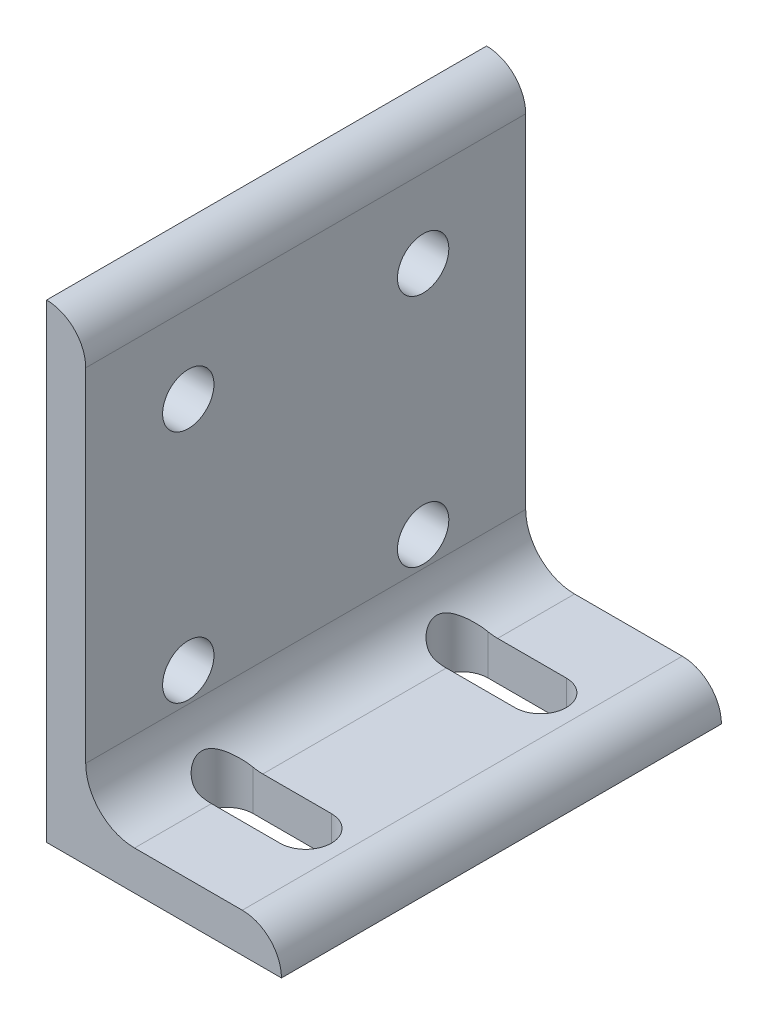
ISO-10303-21;
HEADER;
FILE_DESCRIPTION(('STEP AP214'),'2;1');
FILE_NAME('part.step','',(''),(''),'','','');
FILE_SCHEMA(('AUTOMOTIVE_DESIGN { 1 0 10303 214 1 1 1 1 }'));
ENDSEC;
DATA;
#1=APPLICATION_CONTEXT('core data for automotive mechanical design processes');
#2=APPLICATION_PROTOCOL_DEFINITION('international standard','automotive_design',2000,#1);
#3=PRODUCT_CONTEXT('',#1,'mechanical');
#4=PRODUCT('Part','Part','',(#3));
#5=PRODUCT_RELATED_PRODUCT_CATEGORY('part','',(#4));
#6=PRODUCT_DEFINITION_FORMATION('','',#4);
#7=PRODUCT_DEFINITION_CONTEXT('part definition',#1,'design');
#8=PRODUCT_DEFINITION('design','',#6,#7);
#9=PRODUCT_DEFINITION_SHAPE('','',#8);
#10=(LENGTH_UNIT() NAMED_UNIT(*) SI_UNIT(.MILLI.,.METRE.));
#11=(NAMED_UNIT(*) PLANE_ANGLE_UNIT() SI_UNIT($,.RADIAN.));
#12=(NAMED_UNIT(*) SI_UNIT($,.STERADIAN.) SOLID_ANGLE_UNIT());
#13=UNCERTAINTY_MEASURE_WITH_UNIT(LENGTH_MEASURE(1.E-05),#10,'distance_accuracy_value','');
#14=(GEOMETRIC_REPRESENTATION_CONTEXT(3) GLOBAL_UNCERTAINTY_ASSIGNED_CONTEXT((#13)) GLOBAL_UNIT_ASSIGNED_CONTEXT((#10,
#11,#12)) REPRESENTATION_CONTEXT('',''));
#15=CARTESIAN_POINT('',(0.,0.,0.));
#16=DIRECTION('',(0.,0.,1.));
#17=DIRECTION('',(1.,0.,0.));
#18=AXIS2_PLACEMENT_3D('',#15,#16,#17);
#19=CARTESIAN_POINT('',(38.1,0.,35.687));
#20=DIRECTION('',(0.,1.,0.));
#21=DIRECTION('',(-1.,0.,0.));
#22=AXIS2_PLACEMENT_3D('',#19,#20,#21);
#23=PLANE('',#22);
#24=DIRECTION('',(-1.,0.,0.));
#25=VECTOR('',#24,1.);
#26=CARTESIAN_POINT('',(25.4,0.,-14.8844));
#27=LINE('',#26,#25);
#28=CARTESIAN_POINT('',(25.4,0.,-14.8844));
#29=VERTEX_POINT('',#28);
#30=CARTESIAN_POINT('',(12.7,0.,-14.8844));
#31=VERTEX_POINT('',#30);
#32=EDGE_CURVE('E454',#29,#31,#27,.T.);
#33=ORIENTED_EDGE('',*,*,#32,.F.);
#34=CARTESIAN_POINT('',(25.4,0.,-19.05));
#35=DIRECTION('',(0.,-1.,0.));
#36=DIRECTION('',(1.,0.,0.));
#37=AXIS2_PLACEMENT_3D('',#34,#35,#36);
#38=CIRCLE('',#37,4.1656);
#39=CARTESIAN_POINT('',(25.4,0.,-23.2156));
#40=VERTEX_POINT('',#39);
#41=EDGE_CURVE('E54',#40,#29,#38,.T.);
#42=ORIENTED_EDGE('',*,*,#41,.F.);
#43=DIRECTION('',(1.,0.,0.));
#44=VECTOR('',#43,1.);
#45=CARTESIAN_POINT('',(25.4,0.,-23.2156));
#46=LINE('',#45,#44);
#47=CARTESIAN_POINT('',(12.7,0.,-23.2156));
#48=VERTEX_POINT('',#47);
#49=EDGE_CURVE('E459',#48,#40,#46,.T.);
#50=ORIENTED_EDGE('',*,*,#49,.F.);
#51=CARTESIAN_POINT('',(12.7,0.,-19.05));
#52=DIRECTION('',(0.,-1.,0.));
#53=DIRECTION('',(1.,0.,0.));
#54=AXIS2_PLACEMENT_3D('',#51,#52,#53);
#55=CIRCLE('',#54,4.1656);
#56=EDGE_CURVE('E456',#31,#48,#55,.T.);
#57=ORIENTED_EDGE('',*,*,#56,.F.);
#58=EDGE_LOOP('',(#33,#42,#50,#57));
#59=FACE_BOUND('',#58,.T.);
#60=DIRECTION('',(-1.,0.,0.));
#61=VECTOR('',#60,1.);
#62=CARTESIAN_POINT('',(25.4,0.,23.2156));
#63=LINE('',#62,#61);
#64=CARTESIAN_POINT('',(25.4,0.,23.2156));
#65=VERTEX_POINT('',#64);
#66=CARTESIAN_POINT('',(12.7,0.,23.2156));
#67=VERTEX_POINT('',#66);
#68=EDGE_CURVE('E285',#65,#67,#63,.T.);
#69=ORIENTED_EDGE('',*,*,#68,.F.);
#70=CARTESIAN_POINT('',(25.4,0.,19.05));
#71=DIRECTION('',(0.,-1.,0.));
#72=DIRECTION('',(1.,0.,0.));
#73=AXIS2_PLACEMENT_3D('',#70,#71,#72);
#74=CIRCLE('',#73,4.1656);
#75=CARTESIAN_POINT('',(25.4,0.,14.8844));
#76=VERTEX_POINT('',#75);
#77=EDGE_CURVE('E288',#76,#65,#74,.T.);
#78=ORIENTED_EDGE('',*,*,#77,.F.);
#79=DIRECTION('',(1.,0.,0.));
#80=VECTOR('',#79,1.);
#81=CARTESIAN_POINT('',(25.4,0.,14.8844));
#82=LINE('',#81,#80);
#83=CARTESIAN_POINT('',(12.7,0.,14.8844));
#84=VERTEX_POINT('',#83);
#85=EDGE_CURVE('E275',#84,#76,#82,.T.);
#86=ORIENTED_EDGE('',*,*,#85,.F.);
#87=CARTESIAN_POINT('',(12.7,0.,19.05));
#88=DIRECTION('',(0.,-1.,0.));
#89=DIRECTION('',(1.,0.,0.));
#90=AXIS2_PLACEMENT_3D('',#87,#88,#89);
#91=CIRCLE('',#90,4.1656);
#92=EDGE_CURVE('E282',#67,#84,#91,.T.);
#93=ORIENTED_EDGE('',*,*,#92,.F.);
#94=EDGE_LOOP('',(#69,#78,#86,#93));
#95=FACE_BOUND('',#94,.T.);
#96=DIRECTION('',(1.,0.,0.));
#97=VECTOR('',#96,1.);
#98=CARTESIAN_POINT('',(38.1,0.,-35.687));
#99=LINE('',#98,#97);
#100=CARTESIAN_POINT('',(0.,0.,-35.687));
#101=VERTEX_POINT('',#100);
#102=CARTESIAN_POINT('',(38.1,0.,-35.687));
#103=VERTEX_POINT('',#102);
#104=EDGE_CURVE('E226',#101,#103,#99,.T.);
#105=ORIENTED_EDGE('',*,*,#104,.T.);
#106=DIRECTION('',(0.,0.,-1.));
#107=VECTOR('',#106,1.);
#108=CARTESIAN_POINT('',(38.1,0.,35.687));
#109=LINE('',#108,#107);
#110=CARTESIAN_POINT('',(38.1,0.,35.687));
#111=VERTEX_POINT('',#110);
#112=EDGE_CURVE('E188',#111,#103,#109,.T.);
#113=ORIENTED_EDGE('',*,*,#112,.F.);
#114=DIRECTION('',(1.,0.,0.));
#115=VECTOR('',#114,1.);
#116=CARTESIAN_POINT('',(38.1,0.,35.687));
#117=LINE('',#116,#115);
#118=CARTESIAN_POINT('',(0.,0.,35.687));
#119=VERTEX_POINT('',#118);
#120=EDGE_CURVE('E210',#119,#111,#117,.T.);
#121=ORIENTED_EDGE('',*,*,#120,.F.);
#122=DIRECTION('',(0.,0.,-1.));
#123=VECTOR('',#122,1.);
#124=CARTESIAN_POINT('',(0.,0.,35.687));
#125=LINE('',#124,#123);
#126=EDGE_CURVE('E232',#119,#101,#125,.T.);
#127=ORIENTED_EDGE('',*,*,#126,.T.);
#128=EDGE_LOOP('',(#105,#113,#121,#127));
#129=FACE_BOUND('',#128,.T.);
#130=ADVANCED_FACE('F39',(#59,#95,#129),#23,.F.);
#131=CARTESIAN_POINT('',(14.2748,6.35,35.687));
#132=DIRECTION('',(0.,-1.,0.));
#133=DIRECTION('',(1.,0.,0.));
#134=AXIS2_PLACEMENT_3D('',#131,#132,#133);
#135=PLANE('',#134);
#136=DIRECTION('',(0.,0.,-1.));
#137=VECTOR('',#136,1.);
#138=CARTESIAN_POINT('',(14.2748,6.35,35.687));
#139=LINE('',#138,#137);
#140=CARTESIAN_POINT('',(14.2748,6.35,-23.2156));
#141=VERTEX_POINT('',#140);
#142=CARTESIAN_POINT('',(14.2748,6.35,-35.687));
#143=VERTEX_POINT('',#142);
#144=EDGE_CURVE('E185',#141,#143,#139,.T.);
#145=ORIENTED_EDGE('',*,*,#144,.F.);
#146=DIRECTION('',(-1.,0.,0.));
#147=VECTOR('',#146,1.);
#148=CARTESIAN_POINT('',(25.4,6.34999999999999,-23.2156));
#149=LINE('',#148,#147);
#150=CARTESIAN_POINT('',(25.4,6.34999999999999,-23.2156));
#151=VERTEX_POINT('',#150);
#152=EDGE_CURVE('E451',#151,#141,#149,.T.);
#153=ORIENTED_EDGE('',*,*,#152,.F.);
#154=CARTESIAN_POINT('',(25.4,6.34999999999999,-19.05));
#155=DIRECTION('',(0.,-1.,0.));
#156=DIRECTION('',(1.,0.,0.));
#157=AXIS2_PLACEMENT_3D('',#154,#155,#156);
#158=CIRCLE('',#157,4.1656);
#159=CARTESIAN_POINT('',(25.4,6.34999999999999,-14.8844));
#160=VERTEX_POINT('',#159);
#161=EDGE_CURVE('E176',#160,#151,#158,.F.);
#162=ORIENTED_EDGE('',*,*,#161,.F.);
#163=DIRECTION('',(1.,0.,0.));
#164=VECTOR('',#163,1.);
#165=CARTESIAN_POINT('',(25.4,6.34999999999999,-14.8844));
#166=LINE('',#165,#164);
#167=CARTESIAN_POINT('',(14.2748,6.35,-14.8844));
#168=VERTEX_POINT('',#167);
#169=EDGE_CURVE('E160',#168,#160,#166,.T.);
#170=ORIENTED_EDGE('',*,*,#169,.F.);
#171=CARTESIAN_POINT('',(14.2748,6.35,14.8844));
#172=VERTEX_POINT('',#171);
#173=EDGE_CURVE('E173',#172,#168,#139,.T.);
#174=ORIENTED_EDGE('',*,*,#173,.F.);
#175=DIRECTION('',(-1.,0.,0.));
#176=VECTOR('',#175,1.);
#177=CARTESIAN_POINT('',(25.4,6.34999999999999,14.8844));
#178=LINE('',#177,#176);
#179=CARTESIAN_POINT('',(25.4,6.34999999999999,14.8844));
#180=VERTEX_POINT('',#179);
#181=EDGE_CURVE('E290',#180,#172,#178,.T.);
#182=ORIENTED_EDGE('',*,*,#181,.F.);
#183=CARTESIAN_POINT('',(25.4,6.34999999999999,19.05));
#184=DIRECTION('',(0.,-1.,0.));
#185=DIRECTION('',(1.,0.,0.));
#186=AXIS2_PLACEMENT_3D('',#183,#184,#185);
#187=CIRCLE('',#186,4.1656);
#188=CARTESIAN_POINT('',(25.4,6.34999999999999,23.2156));
#189=VERTEX_POINT('',#188);
#190=EDGE_CURVE('E292',#189,#180,#187,.F.);
#191=ORIENTED_EDGE('',*,*,#190,.F.);
#192=DIRECTION('',(1.,0.,0.));
#193=VECTOR('',#192,1.);
#194=CARTESIAN_POINT('',(25.4,6.34999999999999,23.2156));
#195=LINE('',#194,#193);
#196=CARTESIAN_POINT('',(14.2748,6.35,23.2156));
#197=VERTEX_POINT('',#196);
#198=EDGE_CURVE('E233',#197,#189,#195,.T.);
#199=ORIENTED_EDGE('',*,*,#198,.F.);
#200=CARTESIAN_POINT('',(14.2748,6.35,35.687));
#201=VERTEX_POINT('',#200);
#202=EDGE_CURVE('E184',#201,#197,#139,.T.);
#203=ORIENTED_EDGE('',*,*,#202,.F.);
#204=DIRECTION('',(-1.,0.,0.));
#205=VECTOR('',#204,1.);
#206=CARTESIAN_POINT('',(14.2748,6.35,35.687));
#207=LINE('',#206,#205);
#208=CARTESIAN_POINT('',(31.75,6.35,35.687));
#209=VERTEX_POINT('',#208);
#210=EDGE_CURVE('E207',#209,#201,#207,.T.);
#211=ORIENTED_EDGE('',*,*,#210,.F.);
#212=DIRECTION('',(0.,0.,-1.));
#213=VECTOR('',#212,1.);
#214=CARTESIAN_POINT('',(31.75,6.35,35.687));
#215=LINE('',#214,#213);
#216=CARTESIAN_POINT('',(31.75,6.35,-35.687));
#217=VERTEX_POINT('',#216);
#218=EDGE_CURVE('E195',#209,#217,#215,.T.);
#219=ORIENTED_EDGE('',*,*,#218,.T.);
#220=DIRECTION('',(-1.,0.,0.));
#221=VECTOR('',#220,1.);
#222=CARTESIAN_POINT('',(14.2748,6.35,-35.687));
#223=LINE('',#222,#221);
#224=EDGE_CURVE('E228',#217,#143,#223,.T.);
#225=ORIENTED_EDGE('',*,*,#224,.T.);
#226=EDGE_LOOP('',(#145,#153,#162,#170,#174,#182,#191,#199,#203,#211,#219,#225));
#227=FACE_BOUND('',#226,.T.);
#228=ADVANCED_FACE('F171',(#227),#135,.F.);
#229=CARTESIAN_POINT('',(14.2748,14.2748,35.687));
#230=DIRECTION('',(0.,0.,-1.));
#231=DIRECTION('',(-1.,0.,0.));
#232=AXIS2_PLACEMENT_3D('',#229,#230,#231);
#233=CYLINDRICAL_SURFACE('',#232,7.9248);
#234=CARTESIAN_POINT('',(12.7,6.5080464954783,-23.2156));
#235=CARTESIAN_POINT('',(12.5835580765924,6.5316322027445,-23.2156174053524));
#236=CARTESIAN_POINT('',(12.4676933434238,6.55787464961568,-23.2107187694295));
#237=CARTESIAN_POINT('',(12.2380828578918,6.61528756573018,-23.1915066454322));
#238=CARTESIAN_POINT('',(12.1243353857246,6.64645382103028,-23.1772011752023));
#239=CARTESIAN_POINT('',(11.9004629020729,6.71314980276589,-23.1397151634723));
#240=CARTESIAN_POINT('',(11.7903189589891,6.7486494217396,-23.1165937274753));
#241=CARTESIAN_POINT('',(11.5735592761762,6.82369749415313,-23.0619644114413));
#242=CARTESIAN_POINT('',(11.4669442126567,6.86324671770909,-23.0304549344152));
#243=CARTESIAN_POINT('',(11.1539873654591,6.98693094869243,-22.9243286581881));
#244=CARTESIAN_POINT('',(10.9536021930045,7.07638533753304,-22.8379514388134));
#245=CARTESIAN_POINT('',(10.5719346004298,7.2650354324518,-22.6375098310581));
#246=CARTESIAN_POINT('',(10.3906923921382,7.36425083064593,-22.5233887602133));
#247=CARTESIAN_POINT('',(10.0283860031617,7.58001868893749,-22.2549341898041));
#248=CARTESIAN_POINT('',(9.85008010781651,7.69720346524857,-22.0973826272277));
#249=CARTESIAN_POINT('',(9.52219145004701,7.93007233129113,-21.7537375483742));
#250=CARTESIAN_POINT('',(9.3726111278844,8.04575629274942,-21.5676416096414));
#251=CARTESIAN_POINT('',(9.12625896600255,8.24850232099304,-21.1997725192015));
#252=CARTESIAN_POINT('',(9.02487422812992,8.33719389505684,-21.0219949281517));
#253=CARTESIAN_POINT('',(8.84742149049864,8.49895258090932,-20.6476776411376));
#254=CARTESIAN_POINT('',(8.77130630738444,8.57204872023772,-20.4511738043634));
#255=CARTESIAN_POINT('',(8.66225688177177,8.6795919711303,-20.0874874567676));
#256=CARTESIAN_POINT('',(8.62347457603908,8.71902533273093,-19.9235626355609));
#257=CARTESIAN_POINT('',(8.56591907001295,8.77817530674139,-19.5888243440871));
#258=CARTESIAN_POINT('',(8.54711852353128,8.79791886349328,-19.4180206213376));
#259=CARTESIAN_POINT('',(8.53088867576541,8.81493669321513,-19.0735525068248));
#260=CARTESIAN_POINT('',(8.53354358502664,8.81212242931869,-18.8998795155357));
#261=CARTESIAN_POINT('',(8.56019683034546,8.78425424330877,-18.5559580337462));
#262=CARTESIAN_POINT('',(8.58421373123495,8.75918097684412,-18.3857126536759));
#263=CARTESIAN_POINT('',(8.65780369031963,8.6841840621057,-18.0239872396118));
#264=CARTESIAN_POINT('',(8.71112980332611,8.63066424196057,-17.8340414340611));
#265=CARTESIAN_POINT('',(8.84129823674256,8.50525849196941,-17.4687262960738));
#266=CARTESIAN_POINT('',(8.91818873177567,8.4333349881335,-17.293387769227));
#267=CARTESIAN_POINT('',(9.06363018103846,8.30384494130256,-17.0140727555265));
#268=CARTESIAN_POINT('',(9.12656845322994,8.24936632169107,-16.9056321224522));
#269=CARTESIAN_POINT('',(9.2610143095705,8.13704224540914,-16.6960461980404));
#270=CARTESIAN_POINT('',(9.33252175927476,8.07919684156867,-16.5949007922854));
#271=CARTESIAN_POINT('',(9.48371552093089,7.961547481143,-16.3999095030572));
#272=CARTESIAN_POINT('',(9.56341244113338,7.90174105435644,-16.3060733712995));
#273=CARTESIAN_POINT('',(9.73054656283486,7.78151020507392,-16.1260207724378));
#274=CARTESIAN_POINT('',(9.81798306255859,7.72108583904726,-16.0398036159079));
#275=CARTESIAN_POINT('',(10.0018115278443,7.59974547611755,-15.8739046772898));
#276=CARTESIAN_POINT('',(10.0983271819742,7.53883775067407,-15.7943537815534));
#277=CARTESIAN_POINT('',(10.2987564408494,7.41862125240691,-15.6438355663823));
#278=CARTESIAN_POINT('',(10.4026693181952,7.35931232315557,-15.5728674048191));
#279=CARTESIAN_POINT('',(10.6172568575747,7.24346608950345,-15.4402540950642));
#280=CARTESIAN_POINT('',(10.7279114076557,7.18692136875626,-15.3785829565626));
#281=CARTESIAN_POINT('',(10.9558134721982,7.07738622979663,-15.2649974823181));
#282=CARTESIAN_POINT('',(11.0730609443779,7.02439578879453,-15.2130830840123));
#283=CARTESIAN_POINT('',(11.3093524254135,6.92466825089227,-15.1214108215803));
#284=CARTESIAN_POINT('',(11.4281909862074,6.87777747044408,-15.0812919776815));
#285=CARTESIAN_POINT('',(11.6706923096469,6.78896300700549,-15.0116014689632));
#286=CARTESIAN_POINT('',(11.7943535508775,6.74703777411184,-14.9820265072426));
#287=CARTESIAN_POINT('',(12.0467219375613,6.66850733292112,-14.9339250659229));
#288=CARTESIAN_POINT('',(12.1754640074441,6.63195239223435,-14.9154984941238));
#289=CARTESIAN_POINT('',(12.4358810439194,6.56512440811821,-14.890713648124));
#290=CARTESIAN_POINT('',(12.567559607526,6.5348595974061,-14.8843711023497));
#291=CARTESIAN_POINT('',(12.7,6.5080464954783,-14.8844));
#292=B_SPLINE_CURVE_WITH_KNOTS('',3,(#234,#235,#236,#237,#238,#239,#240,#241,#242,#243,#244,
#245,#246,#247,#248,#249,#250,#251,#252,#253,#254,#255,#256,#257,#258,#259,#260,#261,#262,#263,
#264,#265,#266,#267,#268,#269,#270,#271,#272,#273,#274,#275,#276,#277,#278,#279,#280,#281,#282,
#283,#284,#285,#286,#287,#288,#289,#290,#291),.UNSPECIFIED.,.F.,.F.,(4,2,2,2,2,2,2,2,2,2,2,2,2,
2,2,2,2,2,2,2,2,2,2,2,2,2,2,2,4),(0.,0.35623056460041,0.712157891644708,1.0657397548369,
1.41938898426377,2.12376165412194,2.82958567821204,3.62213731146315,4.41475624289145,
5.08166429224456,5.74731999275772,6.26425629437072,6.78048422431451,7.29873927905102,
7.81744516857059,8.42741656536718,9.0386433912707,9.44829000204645,9.85793018657468,
10.2681078534863,10.6782483661516,11.0951378285751,11.5119863530162,11.9276470386122,
12.3433050587822,12.7444590989697,13.1454875945491,13.5500586889426,13.955156009535),.UNSPECIFIED.);
#293=CARTESIAN_POINT('',(12.7,6.5080464954783,-23.2156));
#294=VERTEX_POINT('',#293);
#295=CARTESIAN_POINT('',(12.7,6.5080464954783,-14.8844));
#296=VERTEX_POINT('',#295);
#297=EDGE_CURVE('E62',#294,#296,#292,.T.);
#298=ORIENTED_EDGE('',*,*,#297,.F.);
#299=CARTESIAN_POINT('',(14.2748,14.2748,-23.2156));
#300=DIRECTION('',(0.,0.,-1.));
#301=DIRECTION('',(-1.,0.,0.));
#302=AXIS2_PLACEMENT_3D('',#299,#300,#301);
#303=CIRCLE('',#302,7.9248);
#304=EDGE_CURVE('E444',#141,#294,#303,.T.);
#305=ORIENTED_EDGE('',*,*,#304,.F.);
#306=ORIENTED_EDGE('',*,*,#144,.T.);
#307=CARTESIAN_POINT('',(14.2748,14.2748,-35.687));
#308=DIRECTION('',(0.,0.,-1.));
#309=DIRECTION('',(1.,0.,0.));
#310=AXIS2_PLACEMENT_3D('',#307,#308,#309);
#311=CIRCLE('',#310,7.9248);
#312=CARTESIAN_POINT('',(6.34999999999999,14.2748,-35.687));
#313=VERTEX_POINT('',#312);
#314=EDGE_CURVE('E235',#143,#313,#311,.T.);
#315=ORIENTED_EDGE('',*,*,#314,.T.);
#316=DIRECTION('',(0.,0.,-1.));
#317=VECTOR('',#316,1.);
#318=CARTESIAN_POINT('',(6.34999999999999,14.2748,35.687));
#319=LINE('',#318,#317);
#320=CARTESIAN_POINT('',(6.34999999999999,14.2748,35.687));
#321=VERTEX_POINT('',#320);
#322=EDGE_CURVE('E189',#321,#313,#319,.T.);
#323=ORIENTED_EDGE('',*,*,#322,.F.);
#324=CARTESIAN_POINT('',(14.2748,14.2748,35.687));
#325=DIRECTION('',(0.,0.,-1.));
#326=DIRECTION('',(1.,0.,0.));
#327=AXIS2_PLACEMENT_3D('',#324,#325,#326);
#328=CIRCLE('',#327,7.9248);
#329=EDGE_CURVE('E218',#201,#321,#328,.T.);
#330=ORIENTED_EDGE('',*,*,#329,.F.);
#331=ORIENTED_EDGE('',*,*,#202,.T.);
#332=CARTESIAN_POINT('',(14.2748,14.2748,23.2156));
#333=DIRECTION('',(0.,0.,1.));
#334=DIRECTION('',(1.,0.,0.));
#335=AXIS2_PLACEMENT_3D('',#332,#333,#334);
#336=CIRCLE('',#335,7.9248);
#337=CARTESIAN_POINT('',(12.7,6.5080464954783,23.2156));
#338=VERTEX_POINT('',#337);
#339=EDGE_CURVE('E238',#338,#197,#336,.T.);
#340=ORIENTED_EDGE('',*,*,#339,.F.);
#341=CARTESIAN_POINT('',(12.7,6.5080464954783,14.8844));
#342=CARTESIAN_POINT('',(12.5835580765924,6.5316322027445,14.8843825946476));
#343=CARTESIAN_POINT('',(12.4676933434238,6.55787464961568,14.8892812305705));
#344=CARTESIAN_POINT('',(12.2380828578918,6.61528756573018,14.9084933545678));
#345=CARTESIAN_POINT('',(12.1243353857246,6.64645382103028,14.9227988247977));
#346=CARTESIAN_POINT('',(11.9004629020729,6.71314980276589,14.9602848365277));
#347=CARTESIAN_POINT('',(11.7903189589891,6.7486494217396,14.9834062725247));
#348=CARTESIAN_POINT('',(11.5735592761762,6.82369749415313,15.0380355885587));
#349=CARTESIAN_POINT('',(11.4669442126567,6.86324671770909,15.0695450655848));
#350=CARTESIAN_POINT('',(11.1539873654591,6.98693094869243,15.1756713418119));
#351=CARTESIAN_POINT('',(10.9536021930045,7.07638533753304,15.2620485611866));
#352=CARTESIAN_POINT('',(10.5719346004298,7.2650354324518,15.4624901689419));
#353=CARTESIAN_POINT('',(10.3906923921382,7.36425083064593,15.5766112397867));
#354=CARTESIAN_POINT('',(10.0283860031617,7.58001868893749,15.8450658101959));
#355=CARTESIAN_POINT('',(9.85008010781651,7.69720346524857,16.0026173727723));
#356=CARTESIAN_POINT('',(9.52219145004701,7.93007233129113,16.3462624516258));
#357=CARTESIAN_POINT('',(9.37261112788441,8.04575629274941,16.5323583903586));
#358=CARTESIAN_POINT('',(9.12625896600255,8.24850232099304,16.9002274807985));
#359=CARTESIAN_POINT('',(9.02487422812993,8.33719389505684,17.0780050718483));
#360=CARTESIAN_POINT('',(8.84742149049864,8.49895258090931,17.4523223588624));
#361=CARTESIAN_POINT('',(8.77130630738444,8.57204872023772,17.6488261956366));
#362=CARTESIAN_POINT('',(8.66225688177177,8.67959197113029,18.0125125432324));
#363=CARTESIAN_POINT('',(8.62347457603908,8.71902533273093,18.1764373644391));
#364=CARTESIAN_POINT('',(8.56591907001295,8.77817530674138,18.5111756559129));
#365=CARTESIAN_POINT('',(8.54711852353128,8.79791886349328,18.6819793786624));
#366=CARTESIAN_POINT('',(8.53088867576541,8.81493669321512,19.0264474931752));
#367=CARTESIAN_POINT('',(8.53354358502665,8.81212242931868,19.2001204844643));
#368=CARTESIAN_POINT('',(8.56019683034547,8.78425424330876,19.5440419662538));
#369=CARTESIAN_POINT('',(8.58421373123496,8.75918097684412,19.7142873463241));
#370=CARTESIAN_POINT('',(8.65780369031964,8.6841840621057,20.0760127603882));
#371=CARTESIAN_POINT('',(8.71112980332611,8.63066424196057,20.2659585659389));
#372=CARTESIAN_POINT('',(8.84129823674257,8.5052584919694,20.6312737039262));
#373=CARTESIAN_POINT('',(8.91818873177568,8.43333498813349,20.806612230773));
#374=CARTESIAN_POINT('',(9.06363018103847,8.30384494130255,21.0859272444735));
#375=CARTESIAN_POINT('',(9.12656845322995,8.24936632169106,21.1943678775478));
#376=CARTESIAN_POINT('',(9.26101430957051,8.13704224540913,21.4039538019596));
#377=CARTESIAN_POINT('',(9.33252175927477,8.07919684156867,21.5050992077146));
#378=CARTESIAN_POINT('',(9.4837155209309,7.961547481143,21.7000904969428));
#379=CARTESIAN_POINT('',(9.56341244113339,7.90174105435643,21.7939266287005));
#380=CARTESIAN_POINT('',(9.73054656283487,7.78151020507392,21.9739792275622));
#381=CARTESIAN_POINT('',(9.8179830625586,7.72108583904725,22.0601963840921));
#382=CARTESIAN_POINT('',(10.0018115278443,7.59974547611754,22.2260953227102));
#383=CARTESIAN_POINT('',(10.0983271819743,7.53883775067407,22.3056462184466));
#384=CARTESIAN_POINT('',(10.2987564408494,7.41862125240691,22.4561644336177));
#385=CARTESIAN_POINT('',(10.4026693181952,7.35931232315556,22.5271325951809));
#386=CARTESIAN_POINT('',(10.6172568575747,7.24346608950344,22.6597459049358));
#387=CARTESIAN_POINT('',(10.7279114076557,7.18692136875626,22.7214170434374));
#388=CARTESIAN_POINT('',(10.9558134721982,7.07738622979663,22.8350025176819));
#389=CARTESIAN_POINT('',(11.0730609443779,7.02439578879452,22.8869169159877));
#390=CARTESIAN_POINT('',(11.3093524254135,6.92466825089226,22.9785891784197));
#391=CARTESIAN_POINT('',(11.4281909862074,6.87777747044407,23.0187080223185));
#392=CARTESIAN_POINT('',(11.6706923096469,6.78896300700549,23.0883985310368));
#393=CARTESIAN_POINT('',(11.7943535508775,6.74703777411184,23.1179734927574));
#394=CARTESIAN_POINT('',(12.0467219375613,6.66850733292112,23.1660749340771));
#395=CARTESIAN_POINT('',(12.1754640074441,6.63195239223434,23.1845015058762));
#396=CARTESIAN_POINT('',(12.4358810439194,6.56512440811821,23.209286351876));
#397=CARTESIAN_POINT('',(12.567559607526,6.5348595974061,23.2156288976503));
#398=CARTESIAN_POINT('',(12.7,6.5080464954783,23.2156));
#399=B_SPLINE_CURVE_WITH_KNOTS('',3,(#341,#342,#343,#344,#345,#346,#347,#348,#349,#350,#351,
#352,#353,#354,#355,#356,#357,#358,#359,#360,#361,#362,#363,#364,#365,#366,#367,#368,#369,#370,
#371,#372,#373,#374,#375,#376,#377,#378,#379,#380,#381,#382,#383,#384,#385,#386,#387,#388,#389,
#390,#391,#392,#393,#394,#395,#396,#397,#398),.UNSPECIFIED.,.F.,.F.,(4,2,2,2,2,2,2,2,2,2,2,2,2,
2,2,2,2,2,2,2,2,2,2,2,2,2,2,2,4),(0.,0.356230564600408,0.712157891644706,1.06573975483689,
1.41938898426377,2.12376165412194,2.82958567821204,3.62213731146315,4.41475624289144,
5.08166429224455,5.74731999275771,6.26425629437072,6.78048422431451,7.29873927905102,
7.81744516857059,8.42741656536718,9.03864339127071,9.44829000204646,9.85793018657468,
10.2681078534863,10.6782483661516,11.0951378285751,11.5119863530162,11.9276470386122,
12.3433050587821,12.7444590989697,13.1454875945491,13.5500586889426,13.955156009535),.UNSPECIFIED.);
#400=CARTESIAN_POINT('',(12.7,6.5080464954783,14.8844));
#401=VERTEX_POINT('',#400);
#402=EDGE_CURVE('E177',#401,#338,#399,.T.);
#403=ORIENTED_EDGE('',*,*,#402,.F.);
#404=CARTESIAN_POINT('',(14.2748,14.2748,14.8844));
#405=DIRECTION('',(0.,0.,-1.));
#406=DIRECTION('',(-1.,0.,0.));
#407=AXIS2_PLACEMENT_3D('',#404,#405,#406);
#408=CIRCLE('',#407,7.9248);
#409=EDGE_CURVE('E183',#172,#401,#408,.T.);
#410=ORIENTED_EDGE('',*,*,#409,.F.);
#411=ORIENTED_EDGE('',*,*,#173,.T.);
#412=CARTESIAN_POINT('',(14.2748,14.2748,-14.8844));
#413=DIRECTION('',(0.,0.,1.));
#414=DIRECTION('',(1.,0.,0.));
#415=AXIS2_PLACEMENT_3D('',#412,#413,#414);
#416=CIRCLE('',#415,7.9248);
#417=EDGE_CURVE('E157',#296,#168,#416,.T.);
#418=ORIENTED_EDGE('',*,*,#417,.F.);
#419=EDGE_LOOP('',(#298,#305,#306,#315,#323,#330,#331,#340,#403,#410,#411,#418));
#420=FACE_BOUND('',#419,.T.);
#421=ADVANCED_FACE('F180',(#420),#233,.F.);
#422=CARTESIAN_POINT('',(6.34999999999999,76.2,35.687));
#423=DIRECTION('',(-1.,0.,0.));
#424=DIRECTION('',(0.,-1.,0.));
#425=AXIS2_PLACEMENT_3D('',#422,#423,#424);
#426=PLANE('',#425);
#427=CARTESIAN_POINT('',(6.34999999999999,57.15,-19.05));
#428=DIRECTION('',(-1.,0.,0.));
#429=DIRECTION('',(0.,-1.,0.));
#430=AXIS2_PLACEMENT_3D('',#427,#428,#429);
#431=CIRCLE('',#430,4.1656);
#432=CARTESIAN_POINT('',(6.34999999999999,52.9844,-19.05));
#433=VERTEX_POINT('',#432);
#434=EDGE_CURVE('E486',#433,#433,#431,.T.);
#435=ORIENTED_EDGE('',*,*,#434,.T.);
#436=EDGE_LOOP('',(#435));
#437=FACE_BOUND('',#436,.T.);
#438=CARTESIAN_POINT('',(6.34999999999999,19.05,19.05));
#439=DIRECTION('',(-1.,0.,0.));
#440=DIRECTION('',(0.,-1.,0.));
#441=AXIS2_PLACEMENT_3D('',#438,#439,#440);
#442=CIRCLE('',#441,4.1656);
#443=CARTESIAN_POINT('',(6.35,14.8844,19.05));
#444=VERTEX_POINT('',#443);
#445=EDGE_CURVE('E480',#444,#444,#442,.T.);
#446=ORIENTED_EDGE('',*,*,#445,.T.);
#447=EDGE_LOOP('',(#446));
#448=FACE_BOUND('',#447,.T.);
#449=CARTESIAN_POINT('',(6.34999999999999,19.05,-19.05));
#450=DIRECTION('',(-1.,0.,0.));
#451=DIRECTION('',(0.,-1.,0.));
#452=AXIS2_PLACEMENT_3D('',#449,#450,#451);
#453=CIRCLE('',#452,4.1656);
#454=CARTESIAN_POINT('',(6.35,14.8844,-19.05));
#455=VERTEX_POINT('',#454);
#456=EDGE_CURVE('E474',#455,#455,#453,.T.);
#457=ORIENTED_EDGE('',*,*,#456,.T.);
#458=EDGE_LOOP('',(#457));
#459=FACE_BOUND('',#458,.T.);
#460=CARTESIAN_POINT('',(6.34999999999999,57.15,19.05));
#461=DIRECTION('',(-1.,0.,0.));
#462=DIRECTION('',(0.,-1.,0.));
#463=AXIS2_PLACEMENT_3D('',#460,#461,#462);
#464=CIRCLE('',#463,4.1656);
#465=CARTESIAN_POINT('',(6.34999999999999,52.9844,19.05));
#466=VERTEX_POINT('',#465);
#467=EDGE_CURVE('E445',#466,#466,#464,.T.);
#468=ORIENTED_EDGE('',*,*,#467,.T.);
#469=EDGE_LOOP('',(#468));
#470=FACE_BOUND('',#469,.T.);
#471=DIRECTION('',(0.,1.,0.));
#472=VECTOR('',#471,1.);
#473=CARTESIAN_POINT('',(6.34999999999999,76.2,-35.687));
#474=LINE('',#473,#472);
#475=CARTESIAN_POINT('',(6.34999999999999,69.85,-35.687));
#476=VERTEX_POINT('',#475);
#477=EDGE_CURVE('E245',#313,#476,#474,.T.);
#478=ORIENTED_EDGE('',*,*,#477,.T.);
#479=DIRECTION('',(0.,0.,-1.));
#480=VECTOR('',#479,1.);
#481=CARTESIAN_POINT('',(6.34999999999999,69.85,35.687));
#482=LINE('',#481,#480);
#483=CARTESIAN_POINT('',(6.34999999999999,69.85,35.687));
#484=VERTEX_POINT('',#483);
#485=EDGE_CURVE('E11',#476,#484,#482,.F.);
#486=ORIENTED_EDGE('',*,*,#485,.T.);
#487=DIRECTION('',(0.,1.,0.));
#488=VECTOR('',#487,1.);
#489=CARTESIAN_POINT('',(6.34999999999999,76.2,35.687));
#490=LINE('',#489,#488);
#491=EDGE_CURVE('E263',#321,#484,#490,.T.);
#492=ORIENTED_EDGE('',*,*,#491,.F.);
#493=ORIENTED_EDGE('',*,*,#322,.T.);
#494=EDGE_LOOP('',(#478,#486,#492,#493));
#495=FACE_BOUND('',#494,.T.);
#496=ADVANCED_FACE('F260',(#437,#448,#459,#470,#495),#426,.F.);
#497=CARTESIAN_POINT('',(0.,0.,35.687));
#498=DIRECTION('',(1.,0.,0.));
#499=DIRECTION('',(0.,1.,0.));
#500=AXIS2_PLACEMENT_3D('',#497,#498,#499);
#501=PLANE('',#500);
#502=CARTESIAN_POINT('',(0.,57.15,-19.05));
#503=DIRECTION('',(-1.,0.,0.));
#504=DIRECTION('',(0.,1.,0.));
#505=AXIS2_PLACEMENT_3D('',#502,#503,#504);
#506=CIRCLE('',#505,4.1656);
#507=CARTESIAN_POINT('',(0.,61.3156,-19.05));
#508=VERTEX_POINT('',#507);
#509=EDGE_CURVE('E489',#508,#508,#506,.T.);
#510=ORIENTED_EDGE('',*,*,#509,.F.);
#511=EDGE_LOOP('',(#510));
#512=FACE_BOUND('',#511,.T.);
#513=CARTESIAN_POINT('',(0.,19.05,19.05));
#514=DIRECTION('',(-1.,0.,0.));
#515=DIRECTION('',(0.,-1.,0.));
#516=AXIS2_PLACEMENT_3D('',#513,#514,#515);
#517=CIRCLE('',#516,4.1656);
#518=CARTESIAN_POINT('',(0.,14.8844,19.05));
#519=VERTEX_POINT('',#518);
#520=EDGE_CURVE('E483',#519,#519,#517,.T.);
#521=ORIENTED_EDGE('',*,*,#520,.F.);
#522=EDGE_LOOP('',(#521));
#523=FACE_BOUND('',#522,.T.);
#524=CARTESIAN_POINT('',(0.,19.05,-19.05));
#525=DIRECTION('',(-1.,0.,0.));
#526=DIRECTION('',(0.,1.,0.));
#527=AXIS2_PLACEMENT_3D('',#524,#525,#526);
#528=CIRCLE('',#527,4.1656);
#529=CARTESIAN_POINT('',(0.,23.2156,-19.05));
#530=VERTEX_POINT('',#529);
#531=EDGE_CURVE('E477',#530,#530,#528,.T.);
#532=ORIENTED_EDGE('',*,*,#531,.F.);
#533=EDGE_LOOP('',(#532));
#534=FACE_BOUND('',#533,.T.);
#535=CARTESIAN_POINT('',(0.,57.15,19.05));
#536=DIRECTION('',(-1.,0.,0.));
#537=DIRECTION('',(0.,-1.,0.));
#538=AXIS2_PLACEMENT_3D('',#535,#536,#537);
#539=CIRCLE('',#538,4.1656);
#540=CARTESIAN_POINT('',(0.,52.9844,19.05));
#541=VERTEX_POINT('',#540);
#542=EDGE_CURVE('E471',#541,#541,#539,.T.);
#543=ORIENTED_EDGE('',*,*,#542,.F.);
#544=EDGE_LOOP('',(#543));
#545=FACE_BOUND('',#544,.T.);
#546=DIRECTION('',(0.,-1.,0.));
#547=VECTOR('',#546,1.);
#548=CARTESIAN_POINT('',(0.,0.,-35.687));
#549=LINE('',#548,#547);
#550=CARTESIAN_POINT('',(0.,76.2,-35.687));
#551=VERTEX_POINT('',#550);
#552=EDGE_CURVE('E248',#551,#101,#549,.T.);
#553=ORIENTED_EDGE('',*,*,#552,.T.);
#554=ORIENTED_EDGE('',*,*,#126,.F.);
#555=DIRECTION('',(0.,-1.,0.));
#556=VECTOR('',#555,1.);
#557=CARTESIAN_POINT('',(0.,0.,35.687));
#558=LINE('',#557,#556);
#559=CARTESIAN_POINT('',(0.,76.2,35.687));
#560=VERTEX_POINT('',#559);
#561=EDGE_CURVE('E241',#560,#119,#558,.T.);
#562=ORIENTED_EDGE('',*,*,#561,.F.);
#563=DIRECTION('',(0.,0.,-1.));
#564=VECTOR('',#563,1.);
#565=CARTESIAN_POINT('',(0.,76.2,35.687));
#566=LINE('',#565,#564);
#567=EDGE_CURVE('E250',#560,#551,#566,.T.);
#568=ORIENTED_EDGE('',*,*,#567,.T.);
#569=EDGE_LOOP('',(#553,#554,#562,#568));
#570=FACE_BOUND('',#569,.T.);
#571=ADVANCED_FACE('F341',(#512,#523,#534,#545,#570),#501,.F.);
#572=CARTESIAN_POINT('',(14.2748,14.2748,35.687));
#573=DIRECTION('',(0.,0.,1.));
#574=DIRECTION('',(1.,0.,0.));
#575=AXIS2_PLACEMENT_3D('',#572,#573,#574);
#576=PLANE('',#575);
#577=ORIENTED_EDGE('',*,*,#120,.T.);
#578=CARTESIAN_POINT('',(31.75,0.,35.687));
#579=DIRECTION('',(0.,0.,1.));
#580=DIRECTION('',(1.,0.,0.));
#581=AXIS2_PLACEMENT_3D('',#578,#579,#580);
#582=CIRCLE('',#581,6.35);
#583=EDGE_CURVE('E47',#111,#209,#582,.T.);
#584=ORIENTED_EDGE('',*,*,#583,.T.);
#585=ORIENTED_EDGE('',*,*,#210,.T.);
#586=ORIENTED_EDGE('',*,*,#329,.T.);
#587=ORIENTED_EDGE('',*,*,#491,.T.);
#588=CARTESIAN_POINT('',(0.,69.85,35.687));
#589=DIRECTION('',(0.,0.,1.));
#590=DIRECTION('',(1.,0.,0.));
#591=AXIS2_PLACEMENT_3D('',#588,#589,#590);
#592=CIRCLE('',#591,6.35);
#593=EDGE_CURVE('E202',#484,#560,#592,.T.);
#594=ORIENTED_EDGE('',*,*,#593,.T.);
#595=ORIENTED_EDGE('',*,*,#561,.T.);
#596=EDGE_LOOP('',(#577,#584,#585,#586,#587,#594,#595));
#597=FACE_BOUND('',#596,.T.);
#598=ADVANCED_FACE('F206',(#597),#576,.T.);
#599=CARTESIAN_POINT('',(14.2748,14.2748,-35.687));
#600=DIRECTION('',(0.,0.,1.));
#601=DIRECTION('',(1.,0.,0.));
#602=AXIS2_PLACEMENT_3D('',#599,#600,#601);
#603=PLANE('',#602);
#604=ORIENTED_EDGE('',*,*,#224,.F.);
#605=CARTESIAN_POINT('',(31.75,0.,-35.687));
#606=DIRECTION('',(0.,0.,1.));
#607=DIRECTION('',(1.,0.,0.));
#608=AXIS2_PLACEMENT_3D('',#605,#606,#607);
#609=CIRCLE('',#608,6.35);
#610=EDGE_CURVE('E200',#217,#103,#609,.F.);
#611=ORIENTED_EDGE('',*,*,#610,.T.);
#612=ORIENTED_EDGE('',*,*,#104,.F.);
#613=ORIENTED_EDGE('',*,*,#552,.F.);
#614=CARTESIAN_POINT('',(0.,69.85,-35.687));
#615=DIRECTION('',(0.,0.,1.));
#616=DIRECTION('',(1.,0.,0.));
#617=AXIS2_PLACEMENT_3D('',#614,#615,#616);
#618=CIRCLE('',#617,6.35);
#619=EDGE_CURVE('E198',#551,#476,#618,.F.);
#620=ORIENTED_EDGE('',*,*,#619,.T.);
#621=ORIENTED_EDGE('',*,*,#477,.F.);
#622=ORIENTED_EDGE('',*,*,#314,.F.);
#623=EDGE_LOOP('',(#604,#611,#612,#613,#620,#621,#622));
#624=FACE_BOUND('',#623,.T.);
#625=ADVANCED_FACE('F224',(#624),#603,.F.);
#626=CARTESIAN_POINT('',(31.75,0.,35.687));
#627=DIRECTION('',(0.,0.,-1.));
#628=DIRECTION('',(-1.,0.,0.));
#629=AXIS2_PLACEMENT_3D('',#626,#627,#628);
#630=CYLINDRICAL_SURFACE('',#629,6.35);
#631=ORIENTED_EDGE('',*,*,#583,.F.);
#632=ORIENTED_EDGE('',*,*,#112,.T.);
#633=ORIENTED_EDGE('',*,*,#610,.F.);
#634=ORIENTED_EDGE('',*,*,#218,.F.);
#635=EDGE_LOOP('',(#631,#632,#633,#634));
#636=FACE_BOUND('',#635,.T.);
#637=ADVANCED_FACE('F220',(#636),#630,.T.);
#638=CARTESIAN_POINT('',(0.,69.85,35.687));
#639=DIRECTION('',(0.,0.,-1.));
#640=DIRECTION('',(-1.,0.,0.));
#641=AXIS2_PLACEMENT_3D('',#638,#639,#640);
#642=CYLINDRICAL_SURFACE('',#641,6.35);
#643=ORIENTED_EDGE('',*,*,#593,.F.);
#644=ORIENTED_EDGE('',*,*,#485,.F.);
#645=ORIENTED_EDGE('',*,*,#619,.F.);
#646=ORIENTED_EDGE('',*,*,#567,.F.);
#647=EDGE_LOOP('',(#643,#644,#645,#646));
#648=FACE_BOUND('',#647,.T.);
#649=ADVANCED_FACE('F41',(#648),#642,.T.);
#650=CARTESIAN_POINT('',(25.4,76.201,19.05));
#651=DIRECTION('',(0.,-1.,0.));
#652=DIRECTION('',(1.,0.,0.));
#653=AXIS2_PLACEMENT_3D('',#650,#651,#652);
#654=CYLINDRICAL_SURFACE('',#653,4.1656);
#655=ORIENTED_EDGE('',*,*,#190,.T.);
#656=DIRECTION('',(0.,-1.,0.));
#657=VECTOR('',#656,1.);
#658=CARTESIAN_POINT('',(25.4,76.201,14.8844));
#659=LINE('',#658,#657);
#660=EDGE_CURVE('E270',#180,#76,#659,.T.);
#661=ORIENTED_EDGE('',*,*,#660,.T.);
#662=ORIENTED_EDGE('',*,*,#77,.T.);
#663=DIRECTION('',(0.,-1.,0.));
#664=VECTOR('',#663,1.);
#665=CARTESIAN_POINT('',(25.4,76.201,23.2156));
#666=LINE('',#665,#664);
#667=EDGE_CURVE('E271',#189,#65,#666,.T.);
#668=ORIENTED_EDGE('',*,*,#667,.F.);
#669=EDGE_LOOP('',(#655,#661,#662,#668));
#670=FACE_BOUND('',#669,.T.);
#671=ADVANCED_FACE('F312',(#670),#654,.F.);
#672=CARTESIAN_POINT('',(25.4,76.201,14.8844));
#673=DIRECTION('',(0.,0.,-1.));
#674=DIRECTION('',(-1.,0.,0.));
#675=AXIS2_PLACEMENT_3D('',#672,#673,#674);
#676=PLANE('',#675);
#677=ORIENTED_EDGE('',*,*,#181,.T.);
#678=ORIENTED_EDGE('',*,*,#409,.T.);
#679=DIRECTION('',(0.,-1.,0.));
#680=VECTOR('',#679,1.);
#681=CARTESIAN_POINT('',(12.7,76.201,14.8844));
#682=LINE('',#681,#680);
#683=EDGE_CURVE('E277',#401,#84,#682,.T.);
#684=ORIENTED_EDGE('',*,*,#683,.T.);
#685=ORIENTED_EDGE('',*,*,#85,.T.);
#686=ORIENTED_EDGE('',*,*,#660,.F.);
#687=EDGE_LOOP('',(#677,#678,#684,#685,#686));
#688=FACE_BOUND('',#687,.T.);
#689=ADVANCED_FACE('F310',(#688),#676,.F.);
#690=CARTESIAN_POINT('',(12.7,76.201,19.05));
#691=DIRECTION('',(0.,-1.,0.));
#692=DIRECTION('',(1.,0.,0.));
#693=AXIS2_PLACEMENT_3D('',#690,#691,#692);
#694=CYLINDRICAL_SURFACE('',#693,4.1656);
#695=ORIENTED_EDGE('',*,*,#402,.T.);
#696=DIRECTION('',(0.,-1.,0.));
#697=VECTOR('',#696,1.);
#698=CARTESIAN_POINT('',(12.7,76.201,23.2156));
#699=LINE('',#698,#697);
#700=EDGE_CURVE('E274',#338,#67,#699,.T.);
#701=ORIENTED_EDGE('',*,*,#700,.T.);
#702=ORIENTED_EDGE('',*,*,#92,.T.);
#703=ORIENTED_EDGE('',*,*,#683,.F.);
#704=EDGE_LOOP('',(#695,#701,#702,#703));
#705=FACE_BOUND('',#704,.T.);
#706=ADVANCED_FACE('F302',(#705),#694,.F.);
#707=CARTESIAN_POINT('',(25.4,76.201,23.2156));
#708=DIRECTION('',(0.,0.,1.));
#709=DIRECTION('',(1.,0.,0.));
#710=AXIS2_PLACEMENT_3D('',#707,#708,#709);
#711=PLANE('',#710);
#712=ORIENTED_EDGE('',*,*,#198,.T.);
#713=ORIENTED_EDGE('',*,*,#667,.T.);
#714=ORIENTED_EDGE('',*,*,#68,.T.);
#715=ORIENTED_EDGE('',*,*,#700,.F.);
#716=ORIENTED_EDGE('',*,*,#339,.T.);
#717=EDGE_LOOP('',(#712,#713,#714,#715,#716));
#718=FACE_BOUND('',#717,.T.);
#719=ADVANCED_FACE('F318',(#718),#711,.F.);
#720=CARTESIAN_POINT('',(25.4,76.201,-19.05));
#721=DIRECTION('',(0.,-1.,0.));
#722=DIRECTION('',(1.,0.,0.));
#723=AXIS2_PLACEMENT_3D('',#720,#721,#722);
#724=CYLINDRICAL_SURFACE('',#723,4.1656);
#725=ORIENTED_EDGE('',*,*,#161,.T.);
#726=DIRECTION('',(0.,-1.,0.));
#727=VECTOR('',#726,1.);
#728=CARTESIAN_POINT('',(25.4,76.201,-23.2156));
#729=LINE('',#728,#727);
#730=EDGE_CURVE('E166',#151,#40,#729,.T.);
#731=ORIENTED_EDGE('',*,*,#730,.T.);
#732=ORIENTED_EDGE('',*,*,#41,.T.);
#733=DIRECTION('',(0.,-1.,0.));
#734=VECTOR('',#733,1.);
#735=CARTESIAN_POINT('',(25.4,76.201,-14.8844));
#736=LINE('',#735,#734);
#737=EDGE_CURVE('E462',#160,#29,#736,.T.);
#738=ORIENTED_EDGE('',*,*,#737,.F.);
#739=EDGE_LOOP('',(#725,#731,#732,#738));
#740=FACE_BOUND('',#739,.T.);
#741=ADVANCED_FACE('F308',(#740),#724,.F.);
#742=CARTESIAN_POINT('',(25.4,76.201,-23.2156));
#743=DIRECTION('',(0.,0.,-1.));
#744=DIRECTION('',(-1.,0.,0.));
#745=AXIS2_PLACEMENT_3D('',#742,#743,#744);
#746=PLANE('',#745);
#747=ORIENTED_EDGE('',*,*,#152,.T.);
#748=ORIENTED_EDGE('',*,*,#304,.T.);
#749=DIRECTION('',(0.,-1.,0.));
#750=VECTOR('',#749,1.);
#751=CARTESIAN_POINT('',(12.7,76.201,-23.2156));
#752=LINE('',#751,#750);
#753=EDGE_CURVE('E464',#294,#48,#752,.T.);
#754=ORIENTED_EDGE('',*,*,#753,.T.);
#755=ORIENTED_EDGE('',*,*,#49,.T.);
#756=ORIENTED_EDGE('',*,*,#730,.F.);
#757=EDGE_LOOP('',(#747,#748,#754,#755,#756));
#758=FACE_BOUND('',#757,.T.);
#759=ADVANCED_FACE('F381',(#758),#746,.F.);
#760=CARTESIAN_POINT('',(12.7,76.201,-19.05));
#761=DIRECTION('',(0.,-1.,0.));
#762=DIRECTION('',(1.,0.,0.));
#763=AXIS2_PLACEMENT_3D('',#760,#761,#762);
#764=CYLINDRICAL_SURFACE('',#763,4.1656);
#765=ORIENTED_EDGE('',*,*,#297,.T.);
#766=DIRECTION('',(0.,-1.,0.));
#767=VECTOR('',#766,1.);
#768=CARTESIAN_POINT('',(12.7,76.201,-14.8844));
#769=LINE('',#768,#767);
#770=EDGE_CURVE('E163',#296,#31,#769,.T.);
#771=ORIENTED_EDGE('',*,*,#770,.T.);
#772=ORIENTED_EDGE('',*,*,#56,.T.);
#773=ORIENTED_EDGE('',*,*,#753,.F.);
#774=EDGE_LOOP('',(#765,#771,#772,#773));
#775=FACE_BOUND('',#774,.T.);
#776=ADVANCED_FACE('F387',(#775),#764,.F.);
#777=CARTESIAN_POINT('',(25.4,76.201,-14.8844));
#778=DIRECTION('',(0.,0.,1.));
#779=DIRECTION('',(1.,0.,0.));
#780=AXIS2_PLACEMENT_3D('',#777,#778,#779);
#781=PLANE('',#780);
#782=ORIENTED_EDGE('',*,*,#169,.T.);
#783=ORIENTED_EDGE('',*,*,#737,.T.);
#784=ORIENTED_EDGE('',*,*,#32,.T.);
#785=ORIENTED_EDGE('',*,*,#770,.F.);
#786=ORIENTED_EDGE('',*,*,#417,.T.);
#787=EDGE_LOOP('',(#782,#783,#784,#785,#786));
#788=FACE_BOUND('',#787,.T.);
#789=ADVANCED_FACE('F159',(#788),#781,.F.);
#790=CARTESIAN_POINT('',(38.1,57.15,19.05));
#791=DIRECTION('',(-1.,0.,0.));
#792=DIRECTION('',(0.,-1.,0.));
#793=AXIS2_PLACEMENT_3D('',#790,#791,#792);
#794=CYLINDRICAL_SURFACE('',#793,4.1656);
#795=ORIENTED_EDGE('',*,*,#542,.T.);
#796=EDGE_LOOP('',(#795));
#797=FACE_BOUND('',#796,.T.);
#798=ORIENTED_EDGE('',*,*,#467,.F.);
#799=EDGE_LOOP('',(#798));
#800=FACE_BOUND('',#799,.T.);
#801=ADVANCED_FACE('F401',(#797,#800),#794,.F.);
#802=CARTESIAN_POINT('',(38.1,19.05,-19.05));
#803=DIRECTION('',(-1.,0.,0.));
#804=DIRECTION('',(0.,-1.,0.));
#805=AXIS2_PLACEMENT_3D('',#802,#803,#804);
#806=CYLINDRICAL_SURFACE('',#805,4.1656);
#807=ORIENTED_EDGE('',*,*,#531,.T.);
#808=EDGE_LOOP('',(#807));
#809=FACE_BOUND('',#808,.T.);
#810=ORIENTED_EDGE('',*,*,#456,.F.);
#811=EDGE_LOOP('',(#810));
#812=FACE_BOUND('',#811,.T.);
#813=ADVANCED_FACE('F407',(#809,#812),#806,.F.);
#814=CARTESIAN_POINT('',(38.1,19.05,19.05));
#815=DIRECTION('',(-1.,0.,0.));
#816=DIRECTION('',(0.,-1.,0.));
#817=AXIS2_PLACEMENT_3D('',#814,#815,#816);
#818=CYLINDRICAL_SURFACE('',#817,4.1656);
#819=ORIENTED_EDGE('',*,*,#520,.T.);
#820=EDGE_LOOP('',(#819));
#821=FACE_BOUND('',#820,.T.);
#822=ORIENTED_EDGE('',*,*,#445,.F.);
#823=EDGE_LOOP('',(#822));
#824=FACE_BOUND('',#823,.T.);
#825=ADVANCED_FACE('F415',(#821,#824),#818,.F.);
#826=CARTESIAN_POINT('',(38.1,57.15,-19.05));
#827=DIRECTION('',(-1.,0.,0.));
#828=DIRECTION('',(0.,-1.,0.));
#829=AXIS2_PLACEMENT_3D('',#826,#827,#828);
#830=CYLINDRICAL_SURFACE('',#829,4.1656);
#831=ORIENTED_EDGE('',*,*,#509,.T.);
#832=EDGE_LOOP('',(#831));
#833=FACE_BOUND('',#832,.T.);
#834=ORIENTED_EDGE('',*,*,#434,.F.);
#835=EDGE_LOOP('',(#834));
#836=FACE_BOUND('',#835,.T.);
#837=ADVANCED_FACE('F423',(#833,#836),#830,.F.);
#838=CLOSED_SHELL('',(#130,#228,#421,#496,#571,#598,#625,#637,#649,#671,#689,#706,#719,#741,
#759,#776,#789,#801,#813,#825,#837));
#839=MANIFOLD_SOLID_BREP('B2',#838);
#840=ADVANCED_BREP_SHAPE_REPRESENTATION('',(#18,#839),#14);
#841=SHAPE_DEFINITION_REPRESENTATION(#9,#840);
ENDSEC;
END-ISO-10303-21;
